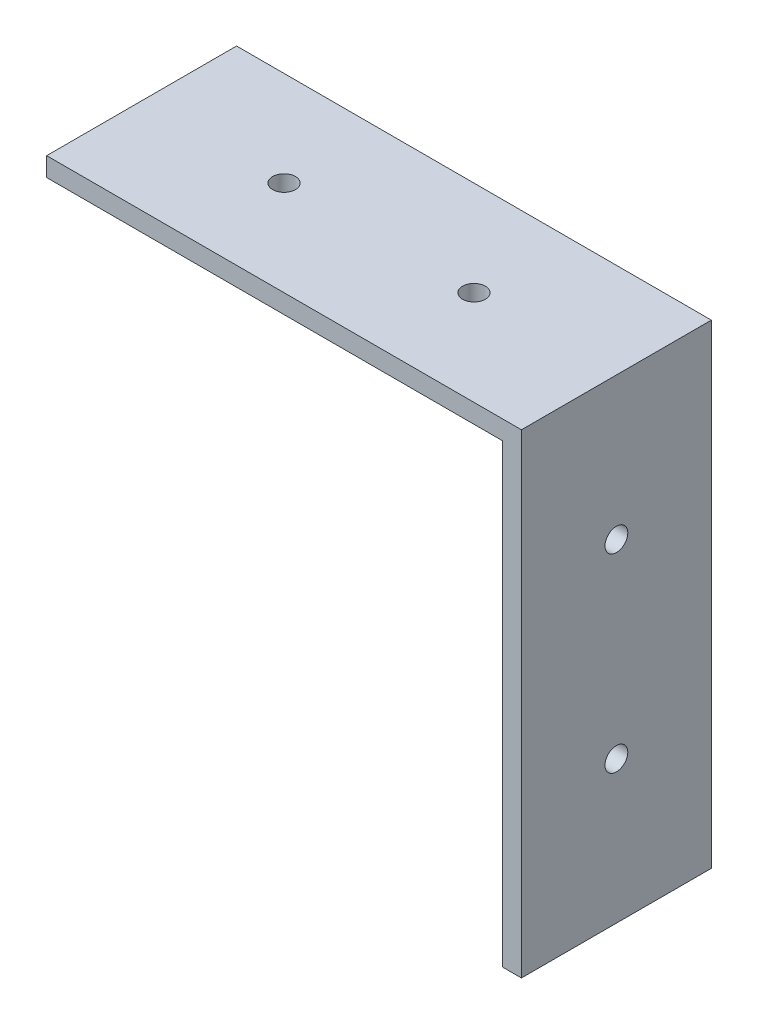
ISO-10303-21;
HEADER;
FILE_DESCRIPTION(('STEP AP214'),'2;1');
FILE_NAME('part.step','',(''),(''),'','','');
FILE_SCHEMA(('AUTOMOTIVE_DESIGN { 1 0 10303 214 1 1 1 1 }'));
ENDSEC;
DATA;
#1=APPLICATION_CONTEXT('core data for automotive mechanical design processes');
#2=APPLICATION_PROTOCOL_DEFINITION('international standard','automotive_design',2000,#1);
#3=PRODUCT_CONTEXT('',#1,'mechanical');
#4=PRODUCT('Part','Part','',(#3));
#5=PRODUCT_RELATED_PRODUCT_CATEGORY('part','',(#4));
#6=PRODUCT_DEFINITION_FORMATION('','',#4);
#7=PRODUCT_DEFINITION_CONTEXT('part definition',#1,'design');
#8=PRODUCT_DEFINITION('design','',#6,#7);
#9=PRODUCT_DEFINITION_SHAPE('','',#8);
#10=(LENGTH_UNIT() NAMED_UNIT(*) SI_UNIT(.MILLI.,.METRE.));
#11=(NAMED_UNIT(*) PLANE_ANGLE_UNIT() SI_UNIT($,.RADIAN.));
#12=(NAMED_UNIT(*) SI_UNIT($,.STERADIAN.) SOLID_ANGLE_UNIT());
#13=UNCERTAINTY_MEASURE_WITH_UNIT(LENGTH_MEASURE(1.E-05),#10,'distance_accuracy_value','');
#14=(GEOMETRIC_REPRESENTATION_CONTEXT(3) GLOBAL_UNCERTAINTY_ASSIGNED_CONTEXT((#13)) GLOBAL_UNIT_ASSIGNED_CONTEXT((#10,
#11,#12)) REPRESENTATION_CONTEXT('',''));
#15=CARTESIAN_POINT('',(0.,0.,0.));
#16=DIRECTION('',(0.,0.,1.));
#17=DIRECTION('',(1.,0.,0.));
#18=AXIS2_PLACEMENT_3D('',#15,#16,#17);
#19=CARTESIAN_POINT('',(0.,0.,20.));
#20=DIRECTION('',(0.,-1.,0.));
#21=DIRECTION('',(1.,0.,0.));
#22=AXIS2_PLACEMENT_3D('',#19,#20,#21);
#23=PLANE('',#22);
#24=CARTESIAN_POINT('',(-35.,0.,10.));
#25=DIRECTION('',(0.,1.,0.));
#26=DIRECTION('',(0.,0.,1.));
#27=AXIS2_PLACEMENT_3D('',#24,#25,#26);
#28=CIRCLE('',#27,1.19999999999999);
#29=CARTESIAN_POINT('',(-35.,0.,11.2));
#30=VERTEX_POINT('',#29);
#31=EDGE_CURVE('E166',#30,#30,#28,.T.);
#32=ORIENTED_EDGE('',*,*,#31,.F.);
#33=EDGE_LOOP('',(#32));
#34=FACE_BOUND('',#33,.T.);
#35=CARTESIAN_POINT('',(-15.,0.,10.));
#36=DIRECTION('',(0.,1.,0.));
#37=DIRECTION('',(0.,0.,1.));
#38=AXIS2_PLACEMENT_3D('',#35,#36,#37);
#39=CIRCLE('',#38,1.19999999999999);
#40=CARTESIAN_POINT('',(-15.,0.,11.2));
#41=VERTEX_POINT('',#40);
#42=EDGE_CURVE('E169',#41,#41,#39,.T.);
#43=ORIENTED_EDGE('',*,*,#42,.F.);
#44=EDGE_LOOP('',(#43));
#45=FACE_BOUND('',#44,.T.);
#46=DIRECTION('',(-1.,0.,0.));
#47=VECTOR('',#46,1.);
#48=CARTESIAN_POINT('',(0.,0.,0.));
#49=LINE('',#48,#47);
#50=CARTESIAN_POINT('',(0.,0.,0.));
#51=VERTEX_POINT('',#50);
#52=CARTESIAN_POINT('',(-50.,0.,0.));
#53=VERTEX_POINT('',#52);
#54=EDGE_CURVE('E119',#51,#53,#49,.T.);
#55=ORIENTED_EDGE('',*,*,#54,.T.);
#56=DIRECTION('',(0.,0.,-1.));
#57=VECTOR('',#56,1.);
#58=CARTESIAN_POINT('',(-50.,0.,20.));
#59=LINE('',#58,#57);
#60=CARTESIAN_POINT('',(-50.,0.,20.));
#61=VERTEX_POINT('',#60);
#62=EDGE_CURVE('E11',#61,#53,#59,.T.);
#63=ORIENTED_EDGE('',*,*,#62,.F.);
#64=DIRECTION('',(-1.,0.,0.));
#65=VECTOR('',#64,1.);
#66=CARTESIAN_POINT('',(0.,0.,20.));
#67=LINE('',#66,#65);
#68=CARTESIAN_POINT('',(0.,0.,20.));
#69=VERTEX_POINT('',#68);
#70=EDGE_CURVE('E130',#69,#61,#67,.T.);
#71=ORIENTED_EDGE('',*,*,#70,.F.);
#72=DIRECTION('',(0.,0.,-1.));
#73=VECTOR('',#72,1.);
#74=CARTESIAN_POINT('',(0.,0.,20.));
#75=LINE('',#74,#73);
#76=EDGE_CURVE('E115',#69,#51,#75,.T.);
#77=ORIENTED_EDGE('',*,*,#76,.T.);
#78=EDGE_LOOP('',(#55,#63,#71,#77));
#79=FACE_BOUND('',#78,.T.);
#80=ADVANCED_FACE('F34',(#34,#45,#79),#23,.F.);
#81=CARTESIAN_POINT('',(-50.,0.,20.));
#82=DIRECTION('',(1.,0.,0.));
#83=DIRECTION('',(0.,0.,-1.));
#84=AXIS2_PLACEMENT_3D('',#81,#82,#83);
#85=PLANE('',#84);
#86=DIRECTION('',(0.,-1.,0.));
#87=VECTOR('',#86,1.);
#88=CARTESIAN_POINT('',(-50.,0.,0.));
#89=LINE('',#88,#87);
#90=CARTESIAN_POINT('',(-50.,-2.00000000000001,0.));
#91=VERTEX_POINT('',#90);
#92=EDGE_CURVE('E122',#53,#91,#89,.T.);
#93=ORIENTED_EDGE('',*,*,#92,.T.);
#94=DIRECTION('',(0.,0.,-1.));
#95=VECTOR('',#94,1.);
#96=CARTESIAN_POINT('',(-50.,-2.00000000000001,20.));
#97=LINE('',#96,#95);
#98=CARTESIAN_POINT('',(-50.,-2.00000000000001,20.));
#99=VERTEX_POINT('',#98);
#100=EDGE_CURVE('E43',#99,#91,#97,.T.);
#101=ORIENTED_EDGE('',*,*,#100,.F.);
#102=DIRECTION('',(0.,-1.,0.));
#103=VECTOR('',#102,1.);
#104=CARTESIAN_POINT('',(-50.,0.,20.));
#105=LINE('',#104,#103);
#106=EDGE_CURVE('E88',#61,#99,#105,.T.);
#107=ORIENTED_EDGE('',*,*,#106,.F.);
#108=ORIENTED_EDGE('',*,*,#62,.T.);
#109=EDGE_LOOP('',(#93,#101,#107,#108));
#110=FACE_BOUND('',#109,.T.);
#111=ADVANCED_FACE('F158',(#110),#85,.F.);
#112=CARTESIAN_POINT('',(-50.,-2.00000000000001,20.));
#113=DIRECTION('',(0.,1.,0.));
#114=DIRECTION('',(-1.,0.,0.));
#115=AXIS2_PLACEMENT_3D('',#112,#113,#114);
#116=PLANE('',#115);
#117=CARTESIAN_POINT('',(-35.,-2.,10.));
#118=DIRECTION('',(0.,1.,0.));
#119=DIRECTION('',(-1.,0.,0.));
#120=AXIS2_PLACEMENT_3D('',#117,#118,#119);
#121=CIRCLE('',#120,1.19999999999999);
#122=CARTESIAN_POINT('',(-36.2,-2.,10.));
#123=VERTEX_POINT('',#122);
#124=EDGE_CURVE('E171',#123,#123,#121,.T.);
#125=ORIENTED_EDGE('',*,*,#124,.T.);
#126=EDGE_LOOP('',(#125));
#127=FACE_BOUND('',#126,.T.);
#128=CARTESIAN_POINT('',(-15.,-2.,10.));
#129=DIRECTION('',(0.,1.,0.));
#130=DIRECTION('',(-1.,0.,0.));
#131=AXIS2_PLACEMENT_3D('',#128,#129,#130);
#132=CIRCLE('',#131,1.19999999999999);
#133=CARTESIAN_POINT('',(-16.2,-2.,10.));
#134=VERTEX_POINT('',#133);
#135=EDGE_CURVE('E37',#134,#134,#132,.T.);
#136=ORIENTED_EDGE('',*,*,#135,.T.);
#137=EDGE_LOOP('',(#136));
#138=FACE_BOUND('',#137,.T.);
#139=DIRECTION('',(1.,0.,0.));
#140=VECTOR('',#139,1.);
#141=CARTESIAN_POINT('',(-50.,-2.00000000000001,0.));
#142=LINE('',#141,#140);
#143=CARTESIAN_POINT('',(-2.,-2.,0.));
#144=VERTEX_POINT('',#143);
#145=EDGE_CURVE('E125',#91,#144,#142,.T.);
#146=ORIENTED_EDGE('',*,*,#145,.T.);
#147=DIRECTION('',(0.,0.,-1.));
#148=VECTOR('',#147,1.);
#149=CARTESIAN_POINT('',(-2.,-2.,20.));
#150=LINE('',#149,#148);
#151=CARTESIAN_POINT('',(-2.,-2.,20.));
#152=VERTEX_POINT('',#151);
#153=EDGE_CURVE('E110',#152,#144,#150,.T.);
#154=ORIENTED_EDGE('',*,*,#153,.F.);
#155=DIRECTION('',(1.,0.,0.));
#156=VECTOR('',#155,1.);
#157=CARTESIAN_POINT('',(-50.,-2.00000000000001,20.));
#158=LINE('',#157,#156);
#159=EDGE_CURVE('E101',#99,#152,#158,.T.);
#160=ORIENTED_EDGE('',*,*,#159,.F.);
#161=ORIENTED_EDGE('',*,*,#100,.T.);
#162=EDGE_LOOP('',(#146,#154,#160,#161));
#163=FACE_BOUND('',#162,.T.);
#164=ADVANCED_FACE('F137',(#127,#138,#163),#116,.F.);
#165=CARTESIAN_POINT('',(-2.,-2.,20.));
#166=DIRECTION('',(1.,0.,0.));
#167=DIRECTION('',(0.,1.,0.));
#168=AXIS2_PLACEMENT_3D('',#165,#166,#167);
#169=PLANE('',#168);
#170=CARTESIAN_POINT('',(-2.,-15.,10.));
#171=DIRECTION('',(1.,0.,0.));
#172=DIRECTION('',(0.,1.,0.));
#173=AXIS2_PLACEMENT_3D('',#170,#171,#172);
#174=CIRCLE('',#173,1.19999999999999);
#175=CARTESIAN_POINT('',(-2.,-13.8,10.));
#176=VERTEX_POINT('',#175);
#177=EDGE_CURVE('E181',#176,#176,#174,.T.);
#178=ORIENTED_EDGE('',*,*,#177,.T.);
#179=EDGE_LOOP('',(#178));
#180=FACE_BOUND('',#179,.T.);
#181=CARTESIAN_POINT('',(-2.,-35.,10.));
#182=DIRECTION('',(1.,0.,0.));
#183=DIRECTION('',(0.,1.,0.));
#184=AXIS2_PLACEMENT_3D('',#181,#182,#183);
#185=CIRCLE('',#184,1.19999999999999);
#186=CARTESIAN_POINT('',(-2.,-33.8,10.));
#187=VERTEX_POINT('',#186);
#188=EDGE_CURVE('E123',#187,#187,#185,.T.);
#189=ORIENTED_EDGE('',*,*,#188,.T.);
#190=EDGE_LOOP('',(#189));
#191=FACE_BOUND('',#190,.T.);
#192=DIRECTION('',(0.,-1.,0.));
#193=VECTOR('',#192,1.);
#194=CARTESIAN_POINT('',(-2.,-2.,0.));
#195=LINE('',#194,#193);
#196=CARTESIAN_POINT('',(-2.,-50.,0.));
#197=VERTEX_POINT('',#196);
#198=EDGE_CURVE('E109',#144,#197,#195,.T.);
#199=ORIENTED_EDGE('',*,*,#198,.T.);
#200=DIRECTION('',(0.,0.,-1.));
#201=VECTOR('',#200,1.);
#202=CARTESIAN_POINT('',(-2.,-50.,20.));
#203=LINE('',#202,#201);
#204=CARTESIAN_POINT('',(-2.,-50.,20.));
#205=VERTEX_POINT('',#204);
#206=EDGE_CURVE('E106',#205,#197,#203,.T.);
#207=ORIENTED_EDGE('',*,*,#206,.F.);
#208=DIRECTION('',(0.,-1.,0.));
#209=VECTOR('',#208,1.);
#210=CARTESIAN_POINT('',(-2.,-2.,20.));
#211=LINE('',#210,#209);
#212=EDGE_CURVE('E95',#152,#205,#211,.T.);
#213=ORIENTED_EDGE('',*,*,#212,.F.);
#214=ORIENTED_EDGE('',*,*,#153,.T.);
#215=EDGE_LOOP('',(#199,#207,#213,#214));
#216=FACE_BOUND('',#215,.T.);
#217=ADVANCED_FACE('F107',(#180,#191,#216),#169,.F.);
#218=CARTESIAN_POINT('',(-2.,-50.,20.));
#219=DIRECTION('',(0.,1.,0.));
#220=DIRECTION('',(0.,0.,1.));
#221=AXIS2_PLACEMENT_3D('',#218,#219,#220);
#222=PLANE('',#221);
#223=DIRECTION('',(1.,0.,0.));
#224=VECTOR('',#223,1.);
#225=CARTESIAN_POINT('',(-2.,-50.,0.));
#226=LINE('',#225,#224);
#227=CARTESIAN_POINT('',(0.,-50.,0.));
#228=VERTEX_POINT('',#227);
#229=EDGE_CURVE('E74',#197,#228,#226,.T.);
#230=ORIENTED_EDGE('',*,*,#229,.T.);
#231=DIRECTION('',(0.,0.,-1.));
#232=VECTOR('',#231,1.);
#233=CARTESIAN_POINT('',(0.,-50.,20.));
#234=LINE('',#233,#232);
#235=CARTESIAN_POINT('',(0.,-50.,20.));
#236=VERTEX_POINT('',#235);
#237=EDGE_CURVE('E111',#236,#228,#234,.T.);
#238=ORIENTED_EDGE('',*,*,#237,.F.);
#239=DIRECTION('',(1.,0.,0.));
#240=VECTOR('',#239,1.);
#241=CARTESIAN_POINT('',(-2.,-50.,20.));
#242=LINE('',#241,#240);
#243=EDGE_CURVE('E99',#205,#236,#242,.T.);
#244=ORIENTED_EDGE('',*,*,#243,.F.);
#245=ORIENTED_EDGE('',*,*,#206,.T.);
#246=EDGE_LOOP('',(#230,#238,#244,#245));
#247=FACE_BOUND('',#246,.T.);
#248=ADVANCED_FACE('F113',(#247),#222,.F.);
#249=CARTESIAN_POINT('',(0.,-50.,20.));
#250=DIRECTION('',(-1.,0.,0.));
#251=DIRECTION('',(0.,-1.,0.));
#252=AXIS2_PLACEMENT_3D('',#249,#250,#251);
#253=PLANE('',#252);
#254=CARTESIAN_POINT('',(0.,-15.,10.));
#255=DIRECTION('',(1.,0.,0.));
#256=DIRECTION('',(0.,0.,-1.));
#257=AXIS2_PLACEMENT_3D('',#254,#255,#256);
#258=CIRCLE('',#257,1.19999999999999);
#259=CARTESIAN_POINT('',(0.,-15.,8.80000000000001));
#260=VERTEX_POINT('',#259);
#261=EDGE_CURVE('E174',#260,#260,#258,.T.);
#262=ORIENTED_EDGE('',*,*,#261,.F.);
#263=EDGE_LOOP('',(#262));
#264=FACE_BOUND('',#263,.T.);
#265=CARTESIAN_POINT('',(0.,-35.,10.));
#266=DIRECTION('',(1.,0.,0.));
#267=DIRECTION('',(0.,0.,-1.));
#268=AXIS2_PLACEMENT_3D('',#265,#266,#267);
#269=CIRCLE('',#268,1.19999999999999);
#270=CARTESIAN_POINT('',(0.,-35.,8.80000000000001));
#271=VERTEX_POINT('',#270);
#272=EDGE_CURVE('E184',#271,#271,#269,.T.);
#273=ORIENTED_EDGE('',*,*,#272,.F.);
#274=EDGE_LOOP('',(#273));
#275=FACE_BOUND('',#274,.T.);
#276=DIRECTION('',(0.,1.,0.));
#277=VECTOR('',#276,1.);
#278=CARTESIAN_POINT('',(0.,-50.,0.));
#279=LINE('',#278,#277);
#280=EDGE_CURVE('E80',#228,#51,#279,.T.);
#281=ORIENTED_EDGE('',*,*,#280,.T.);
#282=ORIENTED_EDGE('',*,*,#76,.F.);
#283=DIRECTION('',(0.,1.,0.));
#284=VECTOR('',#283,1.);
#285=CARTESIAN_POINT('',(0.,-50.,20.));
#286=LINE('',#285,#284);
#287=EDGE_CURVE('E51',#236,#69,#286,.T.);
#288=ORIENTED_EDGE('',*,*,#287,.F.);
#289=ORIENTED_EDGE('',*,*,#237,.T.);
#290=EDGE_LOOP('',(#281,#282,#288,#289));
#291=FACE_BOUND('',#290,.T.);
#292=ADVANCED_FACE('F144',(#264,#275,#291),#253,.F.);
#293=CARTESIAN_POINT('',(0.,0.,20.));
#294=DIRECTION('',(0.,0.,1.));
#295=DIRECTION('',(1.,0.,0.));
#296=AXIS2_PLACEMENT_3D('',#293,#294,#295);
#297=PLANE('',#296);
#298=ORIENTED_EDGE('',*,*,#70,.T.);
#299=ORIENTED_EDGE('',*,*,#106,.T.);
#300=ORIENTED_EDGE('',*,*,#159,.T.);
#301=ORIENTED_EDGE('',*,*,#212,.T.);
#302=ORIENTED_EDGE('',*,*,#243,.T.);
#303=ORIENTED_EDGE('',*,*,#287,.T.);
#304=EDGE_LOOP('',(#298,#299,#300,#301,#302,#303));
#305=FACE_BOUND('',#304,.T.);
#306=ADVANCED_FACE('F97',(#305),#297,.T.);
#307=CARTESIAN_POINT('',(0.,0.,0.));
#308=DIRECTION('',(0.,0.,1.));
#309=DIRECTION('',(1.,0.,0.));
#310=AXIS2_PLACEMENT_3D('',#307,#308,#309);
#311=PLANE('',#310);
#312=ORIENTED_EDGE('',*,*,#54,.F.);
#313=ORIENTED_EDGE('',*,*,#280,.F.);
#314=ORIENTED_EDGE('',*,*,#229,.F.);
#315=ORIENTED_EDGE('',*,*,#198,.F.);
#316=ORIENTED_EDGE('',*,*,#145,.F.);
#317=ORIENTED_EDGE('',*,*,#92,.F.);
#318=EDGE_LOOP('',(#312,#313,#314,#315,#316,#317));
#319=FACE_BOUND('',#318,.T.);
#320=ADVANCED_FACE('F140',(#319),#311,.F.);
#321=CARTESIAN_POINT('',(0.,-35.,10.));
#322=DIRECTION('',(1.,0.,0.));
#323=DIRECTION('',(0.,0.,-1.));
#324=AXIS2_PLACEMENT_3D('',#321,#322,#323);
#325=CYLINDRICAL_SURFACE('',#324,1.19999999999999);
#326=ORIENTED_EDGE('',*,*,#272,.T.);
#327=EDGE_LOOP('',(#326));
#328=FACE_BOUND('',#327,.T.);
#329=ORIENTED_EDGE('',*,*,#188,.F.);
#330=EDGE_LOOP('',(#329));
#331=FACE_BOUND('',#330,.T.);
#332=ADVANCED_FACE('F193',(#328,#331),#325,.F.);
#333=CARTESIAN_POINT('',(0.,-15.,10.));
#334=DIRECTION('',(1.,0.,0.));
#335=DIRECTION('',(0.,0.,-1.));
#336=AXIS2_PLACEMENT_3D('',#333,#334,#335);
#337=CYLINDRICAL_SURFACE('',#336,1.19999999999999);
#338=ORIENTED_EDGE('',*,*,#261,.T.);
#339=EDGE_LOOP('',(#338));
#340=FACE_BOUND('',#339,.T.);
#341=ORIENTED_EDGE('',*,*,#177,.F.);
#342=EDGE_LOOP('',(#341));
#343=FACE_BOUND('',#342,.T.);
#344=ADVANCED_FACE('F195',(#340,#343),#337,.F.);
#345=CARTESIAN_POINT('',(-15.,0.,10.));
#346=DIRECTION('',(0.,1.,0.));
#347=DIRECTION('',(0.,0.,1.));
#348=AXIS2_PLACEMENT_3D('',#345,#346,#347);
#349=CYLINDRICAL_SURFACE('',#348,1.19999999999999);
#350=ORIENTED_EDGE('',*,*,#42,.T.);
#351=EDGE_LOOP('',(#350));
#352=FACE_BOUND('',#351,.T.);
#353=ORIENTED_EDGE('',*,*,#135,.F.);
#354=EDGE_LOOP('',(#353));
#355=FACE_BOUND('',#354,.T.);
#356=ADVANCED_FACE('F202',(#352,#355),#349,.F.);
#357=CARTESIAN_POINT('',(-35.,0.,10.));
#358=DIRECTION('',(0.,1.,0.));
#359=DIRECTION('',(0.,0.,1.));
#360=AXIS2_PLACEMENT_3D('',#357,#358,#359);
#361=CYLINDRICAL_SURFACE('',#360,1.19999999999999);
#362=ORIENTED_EDGE('',*,*,#31,.T.);
#363=EDGE_LOOP('',(#362));
#364=FACE_BOUND('',#363,.T.);
#365=ORIENTED_EDGE('',*,*,#124,.F.);
#366=EDGE_LOOP('',(#365));
#367=FACE_BOUND('',#366,.T.);
#368=ADVANCED_FACE('F208',(#364,#367),#361,.F.);
#369=CLOSED_SHELL('',(#80,#111,#164,#217,#248,#292,#306,#320,#332,#344,#356,#368));
#370=MANIFOLD_SOLID_BREP('B2',#369);
#371=ADVANCED_BREP_SHAPE_REPRESENTATION('',(#18,#370),#14);
#372=SHAPE_DEFINITION_REPRESENTATION(#9,#371);
ENDSEC;
END-ISO-10303-21;
